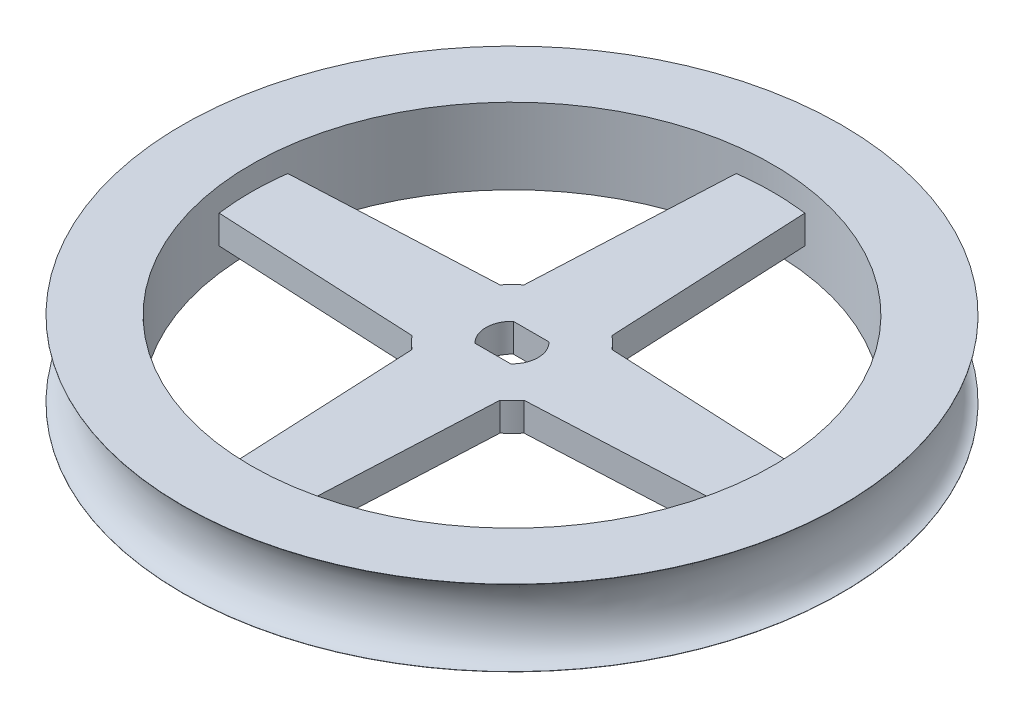
ISO-10303-21;
HEADER;
FILE_DESCRIPTION(('STEP AP214'),'2;1');
FILE_NAME('part.step','',(''),(''),'','','');
FILE_SCHEMA(('AUTOMOTIVE_DESIGN { 1 0 10303 214 1 1 1 1 }'));
ENDSEC;
DATA;
#1=APPLICATION_CONTEXT('core data for automotive mechanical design processes');
#2=APPLICATION_PROTOCOL_DEFINITION('international standard','automotive_design',2000,#1);
#3=PRODUCT_CONTEXT('',#1,'mechanical');
#4=PRODUCT('Part','Part','',(#3));
#5=PRODUCT_RELATED_PRODUCT_CATEGORY('part','',(#4));
#6=PRODUCT_DEFINITION_FORMATION('','',#4);
#7=PRODUCT_DEFINITION_CONTEXT('part definition',#1,'design');
#8=PRODUCT_DEFINITION('design','',#6,#7);
#9=PRODUCT_DEFINITION_SHAPE('','',#8);
#10=(LENGTH_UNIT() NAMED_UNIT(*) SI_UNIT(.MILLI.,.METRE.));
#11=(NAMED_UNIT(*) PLANE_ANGLE_UNIT() SI_UNIT($,.RADIAN.));
#12=(NAMED_UNIT(*) SI_UNIT($,.STERADIAN.) SOLID_ANGLE_UNIT());
#13=UNCERTAINTY_MEASURE_WITH_UNIT(LENGTH_MEASURE(1.E-05),#10,'distance_accuracy_value','');
#14=(GEOMETRIC_REPRESENTATION_CONTEXT(3) GLOBAL_UNCERTAINTY_ASSIGNED_CONTEXT((#13)) GLOBAL_UNIT_ASSIGNED_CONTEXT((#10,
#11,#12)) REPRESENTATION_CONTEXT('',''));
#15=CARTESIAN_POINT('',(0.,0.,0.));
#16=DIRECTION('',(0.,0.,1.));
#17=DIRECTION('',(1.,0.,0.));
#18=AXIS2_PLACEMENT_3D('',#15,#16,#17);
#19=CARTESIAN_POINT('',(0.,1.5,0.));
#20=DIRECTION('',(0.,1.,0.));
#21=DIRECTION('',(0.,0.,1.));
#22=AXIS2_PLACEMENT_3D('',#19,#20,#21);
#23=PLANE('',#22);
#24=CARTESIAN_POINT('',(0.,1.5,0.));
#25=DIRECTION('',(0.,1.,0.));
#26=DIRECTION('',(0.,0.,1.));
#27=AXIS2_PLACEMENT_3D('',#24,#25,#26);
#28=CIRCLE('',#27,7.5);
#29=CARTESIAN_POINT('',(-4.63139295566276,1.5,-5.89916937290644));
#30=VERTEX_POINT('',#29);
#31=CARTESIAN_POINT('',(-5.89916937290616,1.5,-4.63139295566311));
#32=VERTEX_POINT('',#31);
#33=EDGE_CURVE('E214',#30,#32,#28,.T.);
#34=ORIENTED_EDGE('',*,*,#33,.T.);
#35=DIRECTION('',(-0.998869891868631,0.,0.0475282980796581));
#36=VECTOR('',#35,1.);
#37=CARTESIAN_POINT('',(-27.2613690615233,1.5,-3.61493525411162));
#38=LINE('',#37,#36);
#39=CARTESIAN_POINT('',(-27.2613690615233,1.5,-3.61493525411161));
#40=VERTEX_POINT('',#39);
#41=EDGE_CURVE('E217',#32,#40,#38,.T.);
#42=ORIENTED_EDGE('',*,*,#41,.T.);
#43=CARTESIAN_POINT('',(0.,1.5,0.));
#44=DIRECTION('',(0.,1.,0.));
#45=DIRECTION('',(0.,0.,1.));
#46=AXIS2_PLACEMENT_3D('',#43,#44,#45);
#47=CIRCLE('',#46,27.5);
#48=CARTESIAN_POINT('',(-27.2613690615236,1.5,3.61493525410967));
#49=VERTEX_POINT('',#48);
#50=EDGE_CURVE('E220',#40,#49,#47,.T.);
#51=ORIENTED_EDGE('',*,*,#50,.T.);
#52=DIRECTION('',(0.998869891868627,0.,0.0475282980797429));
#53=VECTOR('',#52,1.);
#54=CARTESIAN_POINT('',(-27.2613690615236,1.5,3.61493525410967));
#55=LINE('',#54,#53);
#56=CARTESIAN_POINT('',(-5.89916937290626,1.5,4.63139295566299));
#57=VERTEX_POINT('',#56);
#58=EDGE_CURVE('E222',#49,#57,#55,.T.);
#59=ORIENTED_EDGE('',*,*,#58,.T.);
#60=CARTESIAN_POINT('',(0.,1.5,0.));
#61=DIRECTION('',(0.,1.,0.));
#62=DIRECTION('',(0.,0.,1.));
#63=AXIS2_PLACEMENT_3D('',#60,#61,#62);
#64=CIRCLE('',#63,7.5);
#65=CARTESIAN_POINT('',(-4.63139295566309,1.5,5.89916937290618));
#66=VERTEX_POINT('',#65);
#67=EDGE_CURVE('E224',#57,#66,#64,.T.);
#68=ORIENTED_EDGE('',*,*,#67,.T.);
#69=DIRECTION('',(0.0475282980796571,0.,0.998869891868631));
#70=VECTOR('',#69,1.);
#71=CARTESIAN_POINT('',(-3.61493525411162,1.5,27.2613690615233));
#72=LINE('',#71,#70);
#73=CARTESIAN_POINT('',(-3.61493525411164,1.5,27.2613690615233));
#74=VERTEX_POINT('',#73);
#75=EDGE_CURVE('E226',#66,#74,#72,.T.);
#76=ORIENTED_EDGE('',*,*,#75,.T.);
#77=CARTESIAN_POINT('',(0.,1.5,0.));
#78=DIRECTION('',(0.,1.,0.));
#79=DIRECTION('',(0.,0.,1.));
#80=AXIS2_PLACEMENT_3D('',#77,#78,#79);
#81=CIRCLE('',#80,27.5);
#82=CARTESIAN_POINT('',(3.61493525410967,1.5,27.2613690615236));
#83=VERTEX_POINT('',#82);
#84=EDGE_CURVE('E228',#74,#83,#81,.T.);
#85=ORIENTED_EDGE('',*,*,#84,.T.);
#86=DIRECTION('',(0.0475282980797438,0.,-0.998869891868627));
#87=VECTOR('',#86,1.);
#88=CARTESIAN_POINT('',(3.61493525410967,1.5,27.2613690615236));
#89=LINE('',#88,#87);
#90=CARTESIAN_POINT('',(4.63139295566301,1.5,5.89916937290625));
#91=VERTEX_POINT('',#90);
#92=EDGE_CURVE('E230',#83,#91,#89,.T.);
#93=ORIENTED_EDGE('',*,*,#92,.T.);
#94=CARTESIAN_POINT('',(0.,1.5,0.));
#95=DIRECTION('',(0.,1.,0.));
#96=DIRECTION('',(0.,0.,1.));
#97=AXIS2_PLACEMENT_3D('',#94,#95,#96);
#98=CIRCLE('',#97,7.5);
#99=CARTESIAN_POINT('',(5.89916937290619,1.5,4.63139295566307));
#100=VERTEX_POINT('',#99);
#101=EDGE_CURVE('E232',#91,#100,#98,.T.);
#102=ORIENTED_EDGE('',*,*,#101,.T.);
#103=DIRECTION('',(0.998869891868632,0.,-0.0475282980796561));
#104=VECTOR('',#103,1.);
#105=CARTESIAN_POINT('',(27.2613690615233,1.5,3.61493525411162));
#106=LINE('',#105,#104);
#107=CARTESIAN_POINT('',(27.2613690615233,1.5,3.61493525411162));
#108=VERTEX_POINT('',#107);
#109=EDGE_CURVE('E234',#100,#108,#106,.T.);
#110=ORIENTED_EDGE('',*,*,#109,.T.);
#111=CARTESIAN_POINT('',(0.,1.5,0.));
#112=DIRECTION('',(0.,1.,0.));
#113=DIRECTION('',(0.,0.,1.));
#114=AXIS2_PLACEMENT_3D('',#111,#112,#113);
#115=CIRCLE('',#114,27.5);
#116=CARTESIAN_POINT('',(27.2613690615236,1.5,-3.61493525410967));
#117=VERTEX_POINT('',#116);
#118=EDGE_CURVE('E236',#108,#117,#115,.T.);
#119=ORIENTED_EDGE('',*,*,#118,.T.);
#120=DIRECTION('',(-0.998869891868628,0.,-0.0475282980797327));
#121=VECTOR('',#120,1.);
#122=CARTESIAN_POINT('',(27.2613690615236,1.5,-3.61493525410967));
#123=LINE('',#122,#121);
#124=CARTESIAN_POINT('',(5.89916937290644,1.5,-4.63139295566276));
#125=VERTEX_POINT('',#124);
#126=EDGE_CURVE('E238',#117,#125,#123,.T.);
#127=ORIENTED_EDGE('',*,*,#126,.T.);
#128=CARTESIAN_POINT('',(0.,1.5,0.));
#129=DIRECTION('',(0.,1.,0.));
#130=DIRECTION('',(0.,0.,1.));
#131=AXIS2_PLACEMENT_3D('',#128,#129,#130);
#132=CIRCLE('',#131,7.5);
#133=CARTESIAN_POINT('',(4.63139295566305,1.5,-5.89916937290621));
#134=VERTEX_POINT('',#133);
#135=EDGE_CURVE('E240',#125,#134,#132,.T.);
#136=ORIENTED_EDGE('',*,*,#135,.T.);
#137=DIRECTION('',(-0.0475282980796551,0.,-0.998869891868632));
#138=VECTOR('',#137,1.);
#139=CARTESIAN_POINT('',(3.61493525411163,1.5,-27.2613690615233));
#140=LINE('',#139,#138);
#141=CARTESIAN_POINT('',(3.61493525411162,1.5,-27.2613690615233));
#142=VERTEX_POINT('',#141);
#143=EDGE_CURVE('E242',#134,#142,#140,.T.);
#144=ORIENTED_EDGE('',*,*,#143,.T.);
#145=CARTESIAN_POINT('',(0.,1.5,0.));
#146=DIRECTION('',(0.,1.,0.));
#147=DIRECTION('',(0.,0.,1.));
#148=AXIS2_PLACEMENT_3D('',#145,#146,#147);
#149=CIRCLE('',#148,27.5);
#150=CARTESIAN_POINT('',(-3.61493525410967,1.5,-27.2613690615236));
#151=VERTEX_POINT('',#150);
#152=EDGE_CURVE('E244',#142,#151,#149,.T.);
#153=ORIENTED_EDGE('',*,*,#152,.T.);
#154=DIRECTION('',(-0.0475282980797328,0.,0.998869891868628));
#155=VECTOR('',#154,1.);
#156=CARTESIAN_POINT('',(-3.61493525410967,1.5,-27.2613690615236));
#157=LINE('',#156,#155);
#158=EDGE_CURVE('E246',#151,#30,#157,.T.);
#159=ORIENTED_EDGE('',*,*,#158,.T.);
#160=EDGE_LOOP('',(#34,#42,#51,#59,#68,#76,#85,#93,#102,#110,#119,#127,#136,#144,#153,#159));
#161=FACE_BOUND('',#160,.T.);
#162=DIRECTION('',(1.,0.,0.));
#163=VECTOR('',#162,1.);
#164=CARTESIAN_POINT('',(-1.875,1.5,2.01168461742889));
#165=LINE('',#164,#163);
#166=CARTESIAN_POINT('',(-1.875,1.5,2.01168461742889));
#167=VERTEX_POINT('',#166);
#168=CARTESIAN_POINT('',(1.875,1.5,2.01168461742888));
#169=VERTEX_POINT('',#168);
#170=EDGE_CURVE('E186',#167,#169,#165,.T.);
#171=ORIENTED_EDGE('',*,*,#170,.F.);
#172=CARTESIAN_POINT('',(0.,1.5,0.));
#173=DIRECTION('',(0.,1.,0.));
#174=DIRECTION('',(0.,0.,1.));
#175=AXIS2_PLACEMENT_3D('',#172,#173,#174);
#176=CIRCLE('',#175,2.75);
#177=CARTESIAN_POINT('',(-1.875,1.5,-2.01168461742889));
#178=VERTEX_POINT('',#177);
#179=EDGE_CURVE('E178',#178,#167,#176,.T.);
#180=ORIENTED_EDGE('',*,*,#179,.F.);
#181=DIRECTION('',(-1.,0.,0.));
#182=VECTOR('',#181,1.);
#183=CARTESIAN_POINT('',(-1.875,1.5,-2.01168461742889));
#184=LINE('',#183,#182);
#185=CARTESIAN_POINT('',(1.875,1.5,-2.01168461742889));
#186=VERTEX_POINT('',#185);
#187=EDGE_CURVE('E200',#186,#178,#184,.T.);
#188=ORIENTED_EDGE('',*,*,#187,.F.);
#189=CARTESIAN_POINT('',(0.,1.5,0.));
#190=DIRECTION('',(0.,1.,0.));
#191=DIRECTION('',(0.,0.,1.));
#192=AXIS2_PLACEMENT_3D('',#189,#190,#191);
#193=CIRCLE('',#192,2.75);
#194=EDGE_CURVE('E198',#169,#186,#193,.T.);
#195=ORIENTED_EDGE('',*,*,#194,.F.);
#196=EDGE_LOOP('',(#171,#180,#188,#195));
#197=FACE_BOUND('',#196,.T.);
#198=ADVANCED_FACE('F41',(#161,#197),#23,.T.);
#199=CARTESIAN_POINT('',(0.,-1.5,0.));
#200=DIRECTION('',(0.,1.,0.));
#201=DIRECTION('',(0.,0.,1.));
#202=AXIS2_PLACEMENT_3D('',#199,#200,#201);
#203=PLANE('',#202);
#204=CARTESIAN_POINT('',(0.,-1.5,0.));
#205=DIRECTION('',(0.,1.,0.));
#206=DIRECTION('',(0.,0.,1.));
#207=AXIS2_PLACEMENT_3D('',#204,#205,#206);
#208=CIRCLE('',#207,7.5);
#209=CARTESIAN_POINT('',(-4.63139295566276,-1.5,-5.89916937290644));
#210=VERTEX_POINT('',#209);
#211=CARTESIAN_POINT('',(-5.89916937290616,-1.5,-4.63139295566311));
#212=VERTEX_POINT('',#211);
#213=EDGE_CURVE('E194',#210,#212,#208,.T.);
#214=ORIENTED_EDGE('',*,*,#213,.F.);
#215=DIRECTION('',(-0.0475282980797328,0.,0.998869891868628));
#216=VECTOR('',#215,1.);
#217=CARTESIAN_POINT('',(-3.61493525410967,-1.5,-27.2613690615236));
#218=LINE('',#217,#216);
#219=CARTESIAN_POINT('',(-3.61493525410967,-1.5,-27.2613690615236));
#220=VERTEX_POINT('',#219);
#221=EDGE_CURVE('E218',#220,#210,#218,.T.);
#222=ORIENTED_EDGE('',*,*,#221,.F.);
#223=CARTESIAN_POINT('',(0.,-1.5,0.));
#224=DIRECTION('',(0.,1.,0.));
#225=DIRECTION('',(0.,0.,1.));
#226=AXIS2_PLACEMENT_3D('',#223,#224,#225);
#227=CIRCLE('',#226,27.5);
#228=CARTESIAN_POINT('',(3.61493525411162,-1.5,-27.2613690615233));
#229=VERTEX_POINT('',#228);
#230=EDGE_CURVE('E277',#229,#220,#227,.T.);
#231=ORIENTED_EDGE('',*,*,#230,.F.);
#232=DIRECTION('',(-0.0475282980796551,0.,-0.998869891868632));
#233=VECTOR('',#232,1.);
#234=CARTESIAN_POINT('',(3.61493525411163,-1.5,-27.2613690615233));
#235=LINE('',#234,#233);
#236=CARTESIAN_POINT('',(4.63139295566305,-1.5,-5.89916937290621));
#237=VERTEX_POINT('',#236);
#238=EDGE_CURVE('E275',#237,#229,#235,.T.);
#239=ORIENTED_EDGE('',*,*,#238,.F.);
#240=CARTESIAN_POINT('',(0.,-1.5,0.));
#241=DIRECTION('',(0.,1.,0.));
#242=DIRECTION('',(0.,0.,1.));
#243=AXIS2_PLACEMENT_3D('',#240,#241,#242);
#244=CIRCLE('',#243,7.5);
#245=CARTESIAN_POINT('',(5.89916937290644,-1.5,-4.63139295566276));
#246=VERTEX_POINT('',#245);
#247=EDGE_CURVE('E273',#246,#237,#244,.T.);
#248=ORIENTED_EDGE('',*,*,#247,.F.);
#249=DIRECTION('',(-0.998869891868628,0.,-0.0475282980797327));
#250=VECTOR('',#249,1.);
#251=CARTESIAN_POINT('',(27.2613690615236,-1.5,-3.61493525410967));
#252=LINE('',#251,#250);
#253=CARTESIAN_POINT('',(27.2613690615236,-1.5,-3.61493525410967));
#254=VERTEX_POINT('',#253);
#255=EDGE_CURVE('E271',#254,#246,#252,.T.);
#256=ORIENTED_EDGE('',*,*,#255,.F.);
#257=CARTESIAN_POINT('',(0.,-1.5,0.));
#258=DIRECTION('',(0.,1.,0.));
#259=DIRECTION('',(0.,0.,1.));
#260=AXIS2_PLACEMENT_3D('',#257,#258,#259);
#261=CIRCLE('',#260,27.5);
#262=CARTESIAN_POINT('',(27.2613690615233,-1.5,3.61493525411162));
#263=VERTEX_POINT('',#262);
#264=EDGE_CURVE('E269',#263,#254,#261,.T.);
#265=ORIENTED_EDGE('',*,*,#264,.F.);
#266=DIRECTION('',(0.998869891868632,0.,-0.0475282980796561));
#267=VECTOR('',#266,1.);
#268=CARTESIAN_POINT('',(27.2613690615233,-1.5,3.61493525411162));
#269=LINE('',#268,#267);
#270=CARTESIAN_POINT('',(5.89916937290619,-1.5,4.63139295566307));
#271=VERTEX_POINT('',#270);
#272=EDGE_CURVE('E267',#271,#263,#269,.T.);
#273=ORIENTED_EDGE('',*,*,#272,.F.);
#274=CARTESIAN_POINT('',(0.,-1.5,0.));
#275=DIRECTION('',(0.,1.,0.));
#276=DIRECTION('',(0.,0.,1.));
#277=AXIS2_PLACEMENT_3D('',#274,#275,#276);
#278=CIRCLE('',#277,7.5);
#279=CARTESIAN_POINT('',(4.63139295566301,-1.5,5.89916937290625));
#280=VERTEX_POINT('',#279);
#281=EDGE_CURVE('E265',#280,#271,#278,.T.);
#282=ORIENTED_EDGE('',*,*,#281,.F.);
#283=DIRECTION('',(0.0475282980797438,0.,-0.998869891868627));
#284=VECTOR('',#283,1.);
#285=CARTESIAN_POINT('',(3.61493525410967,-1.5,27.2613690615236));
#286=LINE('',#285,#284);
#287=CARTESIAN_POINT('',(3.61493525410967,-1.5,27.2613690615236));
#288=VERTEX_POINT('',#287);
#289=EDGE_CURVE('E263',#288,#280,#286,.T.);
#290=ORIENTED_EDGE('',*,*,#289,.F.);
#291=CARTESIAN_POINT('',(0.,-1.5,0.));
#292=DIRECTION('',(0.,1.,0.));
#293=DIRECTION('',(0.,0.,1.));
#294=AXIS2_PLACEMENT_3D('',#291,#292,#293);
#295=CIRCLE('',#294,27.5);
#296=CARTESIAN_POINT('',(-3.61493525411164,-1.5,27.2613690615233));
#297=VERTEX_POINT('',#296);
#298=EDGE_CURVE('E261',#297,#288,#295,.T.);
#299=ORIENTED_EDGE('',*,*,#298,.F.);
#300=DIRECTION('',(0.0475282980796571,0.,0.998869891868631));
#301=VECTOR('',#300,1.);
#302=CARTESIAN_POINT('',(-3.61493525411162,-1.5,27.2613690615233));
#303=LINE('',#302,#301);
#304=CARTESIAN_POINT('',(-4.63139295566309,-1.5,5.89916937290618));
#305=VERTEX_POINT('',#304);
#306=EDGE_CURVE('E259',#305,#297,#303,.T.);
#307=ORIENTED_EDGE('',*,*,#306,.F.);
#308=CARTESIAN_POINT('',(0.,-1.5,0.));
#309=DIRECTION('',(0.,1.,0.));
#310=DIRECTION('',(0.,0.,1.));
#311=AXIS2_PLACEMENT_3D('',#308,#309,#310);
#312=CIRCLE('',#311,7.5);
#313=CARTESIAN_POINT('',(-5.89916937290626,-1.5,4.63139295566299));
#314=VERTEX_POINT('',#313);
#315=EDGE_CURVE('E257',#314,#305,#312,.T.);
#316=ORIENTED_EDGE('',*,*,#315,.F.);
#317=DIRECTION('',(0.998869891868627,0.,0.0475282980797429));
#318=VECTOR('',#317,1.);
#319=CARTESIAN_POINT('',(-27.2613690615236,-1.5,3.61493525410967));
#320=LINE('',#319,#318);
#321=CARTESIAN_POINT('',(-27.2613690615236,-1.5,3.61493525410967));
#322=VERTEX_POINT('',#321);
#323=EDGE_CURVE('E255',#322,#314,#320,.T.);
#324=ORIENTED_EDGE('',*,*,#323,.F.);
#325=CARTESIAN_POINT('',(0.,-1.5,0.));
#326=DIRECTION('',(0.,1.,0.));
#327=DIRECTION('',(0.,0.,1.));
#328=AXIS2_PLACEMENT_3D('',#325,#326,#327);
#329=CIRCLE('',#328,27.5);
#330=CARTESIAN_POINT('',(-27.2613690615233,-1.5,-3.61493525411161));
#331=VERTEX_POINT('',#330);
#332=EDGE_CURVE('E253',#331,#322,#329,.T.);
#333=ORIENTED_EDGE('',*,*,#332,.F.);
#334=DIRECTION('',(-0.998869891868631,0.,0.0475282980796581));
#335=VECTOR('',#334,1.);
#336=CARTESIAN_POINT('',(-27.2613690615233,-1.5,-3.61493525411162));
#337=LINE('',#336,#335);
#338=EDGE_CURVE('E251',#212,#331,#337,.T.);
#339=ORIENTED_EDGE('',*,*,#338,.F.);
#340=EDGE_LOOP('',(#214,#222,#231,#239,#248,#256,#265,#273,#282,#290,#299,#307,#316,#324,#333,#339));
#341=FACE_BOUND('',#340,.T.);
#342=CARTESIAN_POINT('',(0.,-1.5,0.));
#343=DIRECTION('',(0.,1.,0.));
#344=DIRECTION('',(0.,0.,1.));
#345=AXIS2_PLACEMENT_3D('',#342,#343,#344);
#346=CIRCLE('',#345,2.75);
#347=CARTESIAN_POINT('',(-1.875,-1.5,-2.01168461742889));
#348=VERTEX_POINT('',#347);
#349=CARTESIAN_POINT('',(-1.875,-1.5,2.01168461742889));
#350=VERTEX_POINT('',#349);
#351=EDGE_CURVE('E64',#348,#350,#346,.T.);
#352=ORIENTED_EDGE('',*,*,#351,.T.);
#353=DIRECTION('',(1.,0.,0.));
#354=VECTOR('',#353,1.);
#355=CARTESIAN_POINT('',(-1.875,-1.5,2.01168461742889));
#356=LINE('',#355,#354);
#357=CARTESIAN_POINT('',(1.875,-1.5,2.01168461742888));
#358=VERTEX_POINT('',#357);
#359=EDGE_CURVE('E193',#350,#358,#356,.T.);
#360=ORIENTED_EDGE('',*,*,#359,.T.);
#361=CARTESIAN_POINT('',(0.,-1.5,0.));
#362=DIRECTION('',(0.,1.,0.));
#363=DIRECTION('',(0.,0.,1.));
#364=AXIS2_PLACEMENT_3D('',#361,#362,#363);
#365=CIRCLE('',#364,2.75);
#366=CARTESIAN_POINT('',(1.875,-1.5,-2.01168461742889));
#367=VERTEX_POINT('',#366);
#368=EDGE_CURVE('E206',#358,#367,#365,.T.);
#369=ORIENTED_EDGE('',*,*,#368,.T.);
#370=DIRECTION('',(-1.,0.,0.));
#371=VECTOR('',#370,1.);
#372=CARTESIAN_POINT('',(-1.875,-1.5,-2.01168461742889));
#373=LINE('',#372,#371);
#374=EDGE_CURVE('E187',#367,#348,#373,.T.);
#375=ORIENTED_EDGE('',*,*,#374,.T.);
#376=EDGE_LOOP('',(#352,#360,#369,#375));
#377=FACE_BOUND('',#376,.T.);
#378=ADVANCED_FACE('F331',(#341,#377),#203,.F.);
#379=CARTESIAN_POINT('',(0.,1.5,0.));
#380=DIRECTION('',(0.,-1.,0.));
#381=DIRECTION('',(0.,0.,-1.));
#382=AXIS2_PLACEMENT_3D('',#379,#380,#381);
#383=CYLINDRICAL_SURFACE('',#382,7.5);
#384=ORIENTED_EDGE('',*,*,#213,.T.);
#385=DIRECTION('',(0.,-1.,0.));
#386=VECTOR('',#385,1.);
#387=CARTESIAN_POINT('',(-5.89916937290616,1.5,-4.63139295566311));
#388=LINE('',#387,#386);
#389=EDGE_CURVE('E12',#32,#212,#388,.T.);
#390=ORIENTED_EDGE('',*,*,#389,.F.);
#391=ORIENTED_EDGE('',*,*,#33,.F.);
#392=DIRECTION('',(0.,-1.,0.));
#393=VECTOR('',#392,1.);
#394=CARTESIAN_POINT('',(-4.63139295566276,1.5,-5.89916937290644));
#395=LINE('',#394,#393);
#396=EDGE_CURVE('E248',#30,#210,#395,.T.);
#397=ORIENTED_EDGE('',*,*,#396,.T.);
#398=EDGE_LOOP('',(#384,#390,#391,#397));
#399=FACE_BOUND('',#398,.T.);
#400=ADVANCED_FACE('F43',(#399),#383,.T.);
#401=CARTESIAN_POINT('',(-27.2613690615233,1.5,-3.61493525411162));
#402=DIRECTION('',(0.0475282980796581,0.,0.998869891868631));
#403=DIRECTION('',(0.998869891868631,0.,-0.0475282980796581));
#404=AXIS2_PLACEMENT_3D('',#401,#402,#403);
#405=PLANE('',#404);
#406=ORIENTED_EDGE('',*,*,#338,.T.);
#407=DIRECTION('',(0.,-1.,0.));
#408=VECTOR('',#407,1.);
#409=CARTESIAN_POINT('',(-27.2613690615233,1.5,-3.61493525411161));
#410=LINE('',#409,#408);
#411=EDGE_CURVE('E49',#40,#331,#410,.T.);
#412=ORIENTED_EDGE('',*,*,#411,.F.);
#413=ORIENTED_EDGE('',*,*,#41,.F.);
#414=ORIENTED_EDGE('',*,*,#389,.T.);
#415=EDGE_LOOP('',(#406,#412,#413,#414));
#416=FACE_BOUND('',#415,.T.);
#417=ADVANCED_FACE('F348',(#416),#405,.F.);
#418=CARTESIAN_POINT('',(0.,1.5,0.));
#419=DIRECTION('',(0.,-1.,0.));
#420=DIRECTION('',(0.,0.,-1.));
#421=AXIS2_PLACEMENT_3D('',#418,#419,#420);
#422=CYLINDRICAL_SURFACE('',#421,27.5);
#423=ORIENTED_EDGE('',*,*,#332,.T.);
#424=DIRECTION('',(0.,-1.,0.));
#425=VECTOR('',#424,1.);
#426=CARTESIAN_POINT('',(-27.2613690615236,1.5,3.61493525410967));
#427=LINE('',#426,#425);
#428=EDGE_CURVE('E318',#49,#322,#427,.T.);
#429=ORIENTED_EDGE('',*,*,#428,.F.);
#430=ORIENTED_EDGE('',*,*,#50,.F.);
#431=ORIENTED_EDGE('',*,*,#411,.T.);
#432=EDGE_LOOP('',(#423,#429,#430,#431));
#433=FACE_BOUND('',#432,.T.);
#434=ADVANCED_FACE('F325',(#433),#422,.T.);
#435=CARTESIAN_POINT('',(-27.2613690615236,1.5,3.61493525410967));
#436=DIRECTION('',(0.0475282980797429,0.,-0.998869891868627));
#437=DIRECTION('',(-0.998869891868627,0.,-0.0475282980797429));
#438=AXIS2_PLACEMENT_3D('',#435,#436,#437);
#439=PLANE('',#438);
#440=ORIENTED_EDGE('',*,*,#323,.T.);
#441=DIRECTION('',(0.,-1.,0.));
#442=VECTOR('',#441,1.);
#443=CARTESIAN_POINT('',(-5.89916937290626,1.5,4.63139295566299));
#444=LINE('',#443,#442);
#445=EDGE_CURVE('E315',#57,#314,#444,.T.);
#446=ORIENTED_EDGE('',*,*,#445,.F.);
#447=ORIENTED_EDGE('',*,*,#58,.F.);
#448=ORIENTED_EDGE('',*,*,#428,.T.);
#449=EDGE_LOOP('',(#440,#446,#447,#448));
#450=FACE_BOUND('',#449,.T.);
#451=ADVANCED_FACE('F337',(#450),#439,.F.);
#452=CARTESIAN_POINT('',(0.,1.5,0.));
#453=DIRECTION('',(0.,-1.,0.));
#454=DIRECTION('',(0.,0.,-1.));
#455=AXIS2_PLACEMENT_3D('',#452,#453,#454);
#456=CYLINDRICAL_SURFACE('',#455,7.5);
#457=ORIENTED_EDGE('',*,*,#315,.T.);
#458=DIRECTION('',(0.,-1.,0.));
#459=VECTOR('',#458,1.);
#460=CARTESIAN_POINT('',(-4.63139295566309,1.5,5.89916937290618));
#461=LINE('',#460,#459);
#462=EDGE_CURVE('E312',#66,#305,#461,.T.);
#463=ORIENTED_EDGE('',*,*,#462,.F.);
#464=ORIENTED_EDGE('',*,*,#67,.F.);
#465=ORIENTED_EDGE('',*,*,#445,.T.);
#466=EDGE_LOOP('',(#457,#463,#464,#465));
#467=FACE_BOUND('',#466,.T.);
#468=ADVANCED_FACE('F341',(#467),#456,.T.);
#469=CARTESIAN_POINT('',(-3.61493525411162,1.5,27.2613690615233));
#470=DIRECTION('',(0.998869891868631,0.,-0.0475282980796571));
#471=DIRECTION('',(-0.0475282980796572,0.,-0.998869891868632));
#472=AXIS2_PLACEMENT_3D('',#469,#470,#471);
#473=PLANE('',#472);
#474=ORIENTED_EDGE('',*,*,#306,.T.);
#475=DIRECTION('',(0.,-1.,0.));
#476=VECTOR('',#475,1.);
#477=CARTESIAN_POINT('',(-3.61493525411164,1.5,27.2613690615233));
#478=LINE('',#477,#476);
#479=EDGE_CURVE('E309',#74,#297,#478,.T.);
#480=ORIENTED_EDGE('',*,*,#479,.F.);
#481=ORIENTED_EDGE('',*,*,#75,.F.);
#482=ORIENTED_EDGE('',*,*,#462,.T.);
#483=EDGE_LOOP('',(#474,#480,#481,#482));
#484=FACE_BOUND('',#483,.T.);
#485=ADVANCED_FACE('F401',(#484),#473,.F.);
#486=CARTESIAN_POINT('',(0.,1.5,0.));
#487=DIRECTION('',(0.,-1.,0.));
#488=DIRECTION('',(0.,0.,-1.));
#489=AXIS2_PLACEMENT_3D('',#486,#487,#488);
#490=CYLINDRICAL_SURFACE('',#489,27.5);
#491=ORIENTED_EDGE('',*,*,#298,.T.);
#492=DIRECTION('',(0.,-1.,0.));
#493=VECTOR('',#492,1.);
#494=CARTESIAN_POINT('',(3.61493525410967,1.5,27.2613690615236));
#495=LINE('',#494,#493);
#496=EDGE_CURVE('E306',#83,#288,#495,.T.);
#497=ORIENTED_EDGE('',*,*,#496,.F.);
#498=ORIENTED_EDGE('',*,*,#84,.F.);
#499=ORIENTED_EDGE('',*,*,#479,.T.);
#500=EDGE_LOOP('',(#491,#497,#498,#499));
#501=FACE_BOUND('',#500,.T.);
#502=ADVANCED_FACE('F398',(#501),#490,.T.);
#503=CARTESIAN_POINT('',(3.61493525410967,1.5,27.2613690615236));
#504=DIRECTION('',(-0.998869891868627,0.,-0.0475282980797438));
#505=DIRECTION('',(-0.0475282980797438,0.,0.998869891868627));
#506=AXIS2_PLACEMENT_3D('',#503,#504,#505);
#507=PLANE('',#506);
#508=ORIENTED_EDGE('',*,*,#289,.T.);
#509=DIRECTION('',(0.,-1.,0.));
#510=VECTOR('',#509,1.);
#511=CARTESIAN_POINT('',(4.63139295566301,1.5,5.89916937290625));
#512=LINE('',#511,#510);
#513=EDGE_CURVE('E303',#91,#280,#512,.T.);
#514=ORIENTED_EDGE('',*,*,#513,.F.);
#515=ORIENTED_EDGE('',*,*,#92,.F.);
#516=ORIENTED_EDGE('',*,*,#496,.T.);
#517=EDGE_LOOP('',(#508,#514,#515,#516));
#518=FACE_BOUND('',#517,.T.);
#519=ADVANCED_FACE('F394',(#518),#507,.F.);
#520=CARTESIAN_POINT('',(0.,1.5,0.));
#521=DIRECTION('',(0.,-1.,0.));
#522=DIRECTION('',(0.,0.,-1.));
#523=AXIS2_PLACEMENT_3D('',#520,#521,#522);
#524=CYLINDRICAL_SURFACE('',#523,7.5);
#525=ORIENTED_EDGE('',*,*,#281,.T.);
#526=DIRECTION('',(0.,-1.,0.));
#527=VECTOR('',#526,1.);
#528=CARTESIAN_POINT('',(5.89916937290619,1.5,4.63139295566307));
#529=LINE('',#528,#527);
#530=EDGE_CURVE('E300',#100,#271,#529,.T.);
#531=ORIENTED_EDGE('',*,*,#530,.F.);
#532=ORIENTED_EDGE('',*,*,#101,.F.);
#533=ORIENTED_EDGE('',*,*,#513,.T.);
#534=EDGE_LOOP('',(#525,#531,#532,#533));
#535=FACE_BOUND('',#534,.T.);
#536=ADVANCED_FACE('F390',(#535),#524,.T.);
#537=CARTESIAN_POINT('',(27.2613690615233,1.5,3.61493525411162));
#538=DIRECTION('',(-0.0475282980796561,0.,-0.998869891868631));
#539=DIRECTION('',(-0.998869891868632,0.,0.0475282980796561));
#540=AXIS2_PLACEMENT_3D('',#537,#538,#539);
#541=PLANE('',#540);
#542=ORIENTED_EDGE('',*,*,#272,.T.);
#543=DIRECTION('',(0.,-1.,0.));
#544=VECTOR('',#543,1.);
#545=CARTESIAN_POINT('',(27.2613690615233,1.5,3.61493525411162));
#546=LINE('',#545,#544);
#547=EDGE_CURVE('E297',#108,#263,#546,.T.);
#548=ORIENTED_EDGE('',*,*,#547,.F.);
#549=ORIENTED_EDGE('',*,*,#109,.F.);
#550=ORIENTED_EDGE('',*,*,#530,.T.);
#551=EDGE_LOOP('',(#542,#548,#549,#550));
#552=FACE_BOUND('',#551,.T.);
#553=ADVANCED_FACE('F385',(#552),#541,.F.);
#554=CARTESIAN_POINT('',(0.,1.5,0.));
#555=DIRECTION('',(0.,-1.,0.));
#556=DIRECTION('',(0.,0.,-1.));
#557=AXIS2_PLACEMENT_3D('',#554,#555,#556);
#558=CYLINDRICAL_SURFACE('',#557,27.5);
#559=ORIENTED_EDGE('',*,*,#264,.T.);
#560=DIRECTION('',(0.,-1.,0.));
#561=VECTOR('',#560,1.);
#562=CARTESIAN_POINT('',(27.2613690615236,1.5,-3.61493525410967));
#563=LINE('',#562,#561);
#564=EDGE_CURVE('E294',#117,#254,#563,.T.);
#565=ORIENTED_EDGE('',*,*,#564,.F.);
#566=ORIENTED_EDGE('',*,*,#118,.F.);
#567=ORIENTED_EDGE('',*,*,#547,.T.);
#568=EDGE_LOOP('',(#559,#565,#566,#567));
#569=FACE_BOUND('',#568,.T.);
#570=ADVANCED_FACE('F379',(#569),#558,.T.);
#571=CARTESIAN_POINT('',(27.2613690615236,1.5,-3.61493525410967));
#572=DIRECTION('',(-0.0475282980797327,0.,0.998869891868628));
#573=DIRECTION('',(0.998869891868628,0.,0.0475282980797328));
#574=AXIS2_PLACEMENT_3D('',#571,#572,#573);
#575=PLANE('',#574);
#576=ORIENTED_EDGE('',*,*,#255,.T.);
#577=DIRECTION('',(0.,-1.,0.));
#578=VECTOR('',#577,1.);
#579=CARTESIAN_POINT('',(5.89916937290644,1.5,-4.63139295566276));
#580=LINE('',#579,#578);
#581=EDGE_CURVE('E291',#125,#246,#580,.T.);
#582=ORIENTED_EDGE('',*,*,#581,.F.);
#583=ORIENTED_EDGE('',*,*,#126,.F.);
#584=ORIENTED_EDGE('',*,*,#564,.T.);
#585=EDGE_LOOP('',(#576,#582,#583,#584));
#586=FACE_BOUND('',#585,.T.);
#587=ADVANCED_FACE('F375',(#586),#575,.F.);
#588=CARTESIAN_POINT('',(0.,1.5,0.));
#589=DIRECTION('',(0.,-1.,0.));
#590=DIRECTION('',(0.,0.,-1.));
#591=AXIS2_PLACEMENT_3D('',#588,#589,#590);
#592=CYLINDRICAL_SURFACE('',#591,7.5);
#593=ORIENTED_EDGE('',*,*,#247,.T.);
#594=DIRECTION('',(0.,-1.,0.));
#595=VECTOR('',#594,1.);
#596=CARTESIAN_POINT('',(4.63139295566305,1.5,-5.89916937290621));
#597=LINE('',#596,#595);
#598=EDGE_CURVE('E288',#134,#237,#597,.T.);
#599=ORIENTED_EDGE('',*,*,#598,.F.);
#600=ORIENTED_EDGE('',*,*,#135,.F.);
#601=ORIENTED_EDGE('',*,*,#581,.T.);
#602=EDGE_LOOP('',(#593,#599,#600,#601));
#603=FACE_BOUND('',#602,.T.);
#604=ADVANCED_FACE('F370',(#603),#592,.T.);
#605=CARTESIAN_POINT('',(3.61493525411163,1.5,-27.2613690615233));
#606=DIRECTION('',(-0.998869891868631,0.,0.0475282980796551));
#607=DIRECTION('',(0.0475282980796551,0.,0.998869891868632));
#608=AXIS2_PLACEMENT_3D('',#605,#606,#607);
#609=PLANE('',#608);
#610=ORIENTED_EDGE('',*,*,#238,.T.);
#611=DIRECTION('',(0.,-1.,0.));
#612=VECTOR('',#611,1.);
#613=CARTESIAN_POINT('',(3.61493525411162,1.5,-27.2613690615233));
#614=LINE('',#613,#612);
#615=EDGE_CURVE('E285',#142,#229,#614,.T.);
#616=ORIENTED_EDGE('',*,*,#615,.F.);
#617=ORIENTED_EDGE('',*,*,#143,.F.);
#618=ORIENTED_EDGE('',*,*,#598,.T.);
#619=EDGE_LOOP('',(#610,#616,#617,#618));
#620=FACE_BOUND('',#619,.T.);
#621=ADVANCED_FACE('F364',(#620),#609,.F.);
#622=CARTESIAN_POINT('',(0.,1.5,0.));
#623=DIRECTION('',(0.,-1.,0.));
#624=DIRECTION('',(0.,0.,-1.));
#625=AXIS2_PLACEMENT_3D('',#622,#623,#624);
#626=CYLINDRICAL_SURFACE('',#625,27.5);
#627=ORIENTED_EDGE('',*,*,#230,.T.);
#628=DIRECTION('',(0.,-1.,0.));
#629=VECTOR('',#628,1.);
#630=CARTESIAN_POINT('',(-3.61493525410967,1.5,-27.2613690615236));
#631=LINE('',#630,#629);
#632=EDGE_CURVE('E282',#151,#220,#631,.T.);
#633=ORIENTED_EDGE('',*,*,#632,.F.);
#634=ORIENTED_EDGE('',*,*,#152,.F.);
#635=ORIENTED_EDGE('',*,*,#615,.T.);
#636=EDGE_LOOP('',(#627,#633,#634,#635));
#637=FACE_BOUND('',#636,.T.);
#638=ADVANCED_FACE('F360',(#637),#626,.T.);
#639=CARTESIAN_POINT('',(-3.61493525410967,1.5,-27.2613690615236));
#640=DIRECTION('',(0.998869891868628,0.,0.0475282980797328));
#641=DIRECTION('',(0.0475282980797328,0.,-0.998869891868628));
#642=AXIS2_PLACEMENT_3D('',#639,#640,#641);
#643=PLANE('',#642);
#644=ORIENTED_EDGE('',*,*,#221,.T.);
#645=ORIENTED_EDGE('',*,*,#396,.F.);
#646=ORIENTED_EDGE('',*,*,#158,.F.);
#647=ORIENTED_EDGE('',*,*,#632,.T.);
#648=EDGE_LOOP('',(#644,#645,#646,#647));
#649=FACE_BOUND('',#648,.T.);
#650=ADVANCED_FACE('F355',(#649),#643,.F.);
#651=CARTESIAN_POINT('',(0.,1.5,0.));
#652=DIRECTION('',(0.,-1.,0.));
#653=DIRECTION('',(0.,0.,-1.));
#654=AXIS2_PLACEMENT_3D('',#651,#652,#653);
#655=CYLINDRICAL_SURFACE('',#654,2.75);
#656=ORIENTED_EDGE('',*,*,#351,.F.);
#657=DIRECTION('',(0.,-1.,0.));
#658=VECTOR('',#657,1.);
#659=CARTESIAN_POINT('',(-1.875,1.5,-2.01168461742889));
#660=LINE('',#659,#658);
#661=EDGE_CURVE('E182',#178,#348,#660,.T.);
#662=ORIENTED_EDGE('',*,*,#661,.F.);
#663=ORIENTED_EDGE('',*,*,#179,.T.);
#664=DIRECTION('',(0.,-1.,0.));
#665=VECTOR('',#664,1.);
#666=CARTESIAN_POINT('',(-1.875,1.5,2.01168461742889));
#667=LINE('',#666,#665);
#668=EDGE_CURVE('E181',#167,#350,#667,.T.);
#669=ORIENTED_EDGE('',*,*,#668,.T.);
#670=EDGE_LOOP('',(#656,#662,#663,#669));
#671=FACE_BOUND('',#670,.T.);
#672=ADVANCED_FACE('F180',(#671),#655,.F.);
#673=CARTESIAN_POINT('',(-1.875,1.5,2.01168461742889));
#674=DIRECTION('',(0.,0.,-1.));
#675=DIRECTION('',(-1.,0.,0.));
#676=AXIS2_PLACEMENT_3D('',#673,#674,#675);
#677=PLANE('',#676);
#678=ORIENTED_EDGE('',*,*,#359,.F.);
#679=ORIENTED_EDGE('',*,*,#668,.F.);
#680=ORIENTED_EDGE('',*,*,#170,.T.);
#681=DIRECTION('',(0.,-1.,0.));
#682=VECTOR('',#681,1.);
#683=CARTESIAN_POINT('',(1.875,1.5,2.01168461742888));
#684=LINE('',#683,#682);
#685=EDGE_CURVE('E195',#169,#358,#684,.T.);
#686=ORIENTED_EDGE('',*,*,#685,.T.);
#687=EDGE_LOOP('',(#678,#679,#680,#686));
#688=FACE_BOUND('',#687,.T.);
#689=ADVANCED_FACE('F190',(#688),#677,.T.);
#690=CARTESIAN_POINT('',(0.,1.5,0.));
#691=DIRECTION('',(0.,-1.,0.));
#692=DIRECTION('',(0.,0.,-1.));
#693=AXIS2_PLACEMENT_3D('',#690,#691,#692);
#694=CYLINDRICAL_SURFACE('',#693,2.75);
#695=ORIENTED_EDGE('',*,*,#368,.F.);
#696=ORIENTED_EDGE('',*,*,#685,.F.);
#697=ORIENTED_EDGE('',*,*,#194,.T.);
#698=DIRECTION('',(0.,-1.,0.));
#699=VECTOR('',#698,1.);
#700=CARTESIAN_POINT('',(1.875,1.5,-2.01168461742889));
#701=LINE('',#700,#699);
#702=EDGE_CURVE('E56',#186,#367,#701,.T.);
#703=ORIENTED_EDGE('',*,*,#702,.T.);
#704=EDGE_LOOP('',(#695,#696,#697,#703));
#705=FACE_BOUND('',#704,.T.);
#706=ADVANCED_FACE('F483',(#705),#694,.F.);
#707=CARTESIAN_POINT('',(-1.875,1.5,-2.01168461742889));
#708=DIRECTION('',(0.,0.,1.));
#709=DIRECTION('',(1.,0.,0.));
#710=AXIS2_PLACEMENT_3D('',#707,#708,#709);
#711=PLANE('',#710);
#712=ORIENTED_EDGE('',*,*,#374,.F.);
#713=ORIENTED_EDGE('',*,*,#702,.F.);
#714=ORIENTED_EDGE('',*,*,#187,.T.);
#715=ORIENTED_EDGE('',*,*,#661,.T.);
#716=EDGE_LOOP('',(#712,#713,#714,#715));
#717=FACE_BOUND('',#716,.T.);
#718=ADVANCED_FACE('F489',(#717),#711,.T.);
#719=CLOSED_SHELL('',(#198,#378,#400,#417,#434,#451,#468,#485,#502,#519,#536,#553,#570,#587,
#604,#621,#638,#650,#672,#689,#706,#718));
#720=MANIFOLD_SOLID_BREP('B2',#719);
#721=CARTESIAN_POINT('',(0.,4.,0.));
#722=DIRECTION('',(0.,1.,0.));
#723=DIRECTION('',(0.,0.,1.));
#724=AXIS2_PLACEMENT_3D('',#721,#722,#723);
#725=PLANE('',#724);
#726=CARTESIAN_POINT('',(0.,4.,0.));
#727=DIRECTION('',(0.,1.,0.));
#728=DIRECTION('',(0.,0.,1.));
#729=AXIS2_PLACEMENT_3D('',#726,#727,#728);
#730=CIRCLE('',#729,27.5);
#731=CARTESIAN_POINT('',(0.,4.,27.5));
#732=VERTEX_POINT('',#731);
#733=EDGE_CURVE('E40',#732,#732,#730,.T.);
#734=ORIENTED_EDGE('',*,*,#733,.F.);
#735=EDGE_LOOP('',(#734));
#736=FACE_BOUND('',#735,.T.);
#737=CARTESIAN_POINT('',(0.,4.,0.));
#738=DIRECTION('',(0.,1.,0.));
#739=DIRECTION('',(0.,0.,1.));
#740=AXIS2_PLACEMENT_3D('',#737,#738,#739);
#741=CIRCLE('',#740,34.7396085764097);
#742=CARTESIAN_POINT('',(0.,4.,34.7396085764097));
#743=VERTEX_POINT('',#742);
#744=EDGE_CURVE('E596',#743,#743,#741,.F.);
#745=ORIENTED_EDGE('',*,*,#744,.F.);
#746=EDGE_LOOP('',(#745));
#747=FACE_BOUND('',#746,.T.);
#748=ADVANCED_FACE('F583',(#736,#747),#725,.T.);
#749=CARTESIAN_POINT('',(0.,-4.,0.));
#750=DIRECTION('',(0.,1.,0.));
#751=DIRECTION('',(0.,0.,1.));
#752=AXIS2_PLACEMENT_3D('',#749,#750,#751);
#753=PLANE('',#752);
#754=CARTESIAN_POINT('',(0.,-4.,0.));
#755=DIRECTION('',(0.,1.,0.));
#756=DIRECTION('',(0.,0.,1.));
#757=AXIS2_PLACEMENT_3D('',#754,#755,#756);
#758=CIRCLE('',#757,27.5);
#759=CARTESIAN_POINT('',(0.,-4.,27.5));
#760=VERTEX_POINT('',#759);
#761=EDGE_CURVE('E591',#760,#760,#758,.T.);
#762=ORIENTED_EDGE('',*,*,#761,.T.);
#763=EDGE_LOOP('',(#762));
#764=FACE_BOUND('',#763,.T.);
#765=CARTESIAN_POINT('',(0.,-4.,0.));
#766=DIRECTION('',(0.,1.,0.));
#767=DIRECTION('',(0.,0.,1.));
#768=AXIS2_PLACEMENT_3D('',#765,#766,#767);
#769=CIRCLE('',#768,34.7396085764097);
#770=CARTESIAN_POINT('',(0.,-4.,34.7396085764097));
#771=VERTEX_POINT('',#770);
#772=EDGE_CURVE('E606',#771,#771,#769,.F.);
#773=ORIENTED_EDGE('',*,*,#772,.T.);
#774=EDGE_LOOP('',(#773));
#775=FACE_BOUND('',#774,.T.);
#776=ADVANCED_FACE('F585',(#764,#775),#753,.F.);
#777=CARTESIAN_POINT('',(0.,4.,0.));
#778=DIRECTION('',(0.,-1.,0.));
#779=DIRECTION('',(0.,0.,-1.));
#780=AXIS2_PLACEMENT_3D('',#777,#778,#779);
#781=CYLINDRICAL_SURFACE('',#780,27.5);
#782=ORIENTED_EDGE('',*,*,#733,.T.);
#783=EDGE_LOOP('',(#782));
#784=FACE_BOUND('',#783,.T.);
#785=ORIENTED_EDGE('',*,*,#761,.F.);
#786=EDGE_LOOP('',(#785));
#787=FACE_BOUND('',#786,.T.);
#788=ADVANCED_FACE('F624',(#784,#787),#781,.F.);
#789=CARTESIAN_POINT('',(0.,8.79245959853953,0.));
#790=DIRECTION('',(0.,1.,0.));
#791=DIRECTION('',(0.,0.,1.));
#792=AXIS2_PLACEMENT_3D('',#789,#790,#791);
#793=CYLINDRICAL_SURFACE('',#792,34.7396085764097);
#794=ORIENTED_EDGE('',*,*,#744,.T.);
#795=EDGE_LOOP('',(#794));
#796=FACE_BOUND('',#795,.T.);
#797=CARTESIAN_POINT('',(0.,3.97759487444089,0.));
#798=DIRECTION('',(0.,1.,0.));
#799=DIRECTION('',(0.,0.,1.));
#800=AXIS2_PLACEMENT_3D('',#797,#798,#799);
#801=CIRCLE('',#800,34.7396085764097);
#802=CARTESIAN_POINT('',(0.,3.97759487444089,34.7396085764097));
#803=VERTEX_POINT('',#802);
#804=EDGE_CURVE('E601',#803,#803,#801,.F.);
#805=ORIENTED_EDGE('',*,*,#804,.F.);
#806=EDGE_LOOP('',(#805));
#807=FACE_BOUND('',#806,.T.);
#808=ADVANCED_FACE('F616',(#796,#807),#793,.T.);
#809=CARTESIAN_POINT('',(0.,-3.97759487444089,0.));
#810=DIRECTION('',(0.,1.,0.));
#811=DIRECTION('',(0.,0.,1.));
#812=AXIS2_PLACEMENT_3D('',#809,#810,#811);
#813=CIRCLE('',#812,34.7396085764097);
#814=CARTESIAN_POINT('',(0.,-3.97759487444089,34.7396085764097));
#815=VERTEX_POINT('',#814);
#816=EDGE_CURVE('E587',#815,#815,#813,.T.);
#817=ORIENTED_EDGE('',*,*,#816,.F.);
#818=EDGE_LOOP('',(#817));
#819=FACE_BOUND('',#818,.T.);
#820=ORIENTED_EDGE('',*,*,#772,.F.);
#821=EDGE_LOOP('',(#820));
#822=FACE_BOUND('',#821,.T.);
#823=ADVANCED_FACE('F632',(#819,#822),#793,.T.);
#824=CARTESIAN_POINT('',(0.,0.,35.));
#825=DIRECTION('',(1.,0.,0.));
#826=DIRECTION('',(0.,-1.,0.));
#827=AXIS2_PLACEMENT_3D('',#824,#825,#826);
#828=ELLIPSE('',#827,4.,2.46363852853754);
#829=CARTESIAN_POINT('',(0.,4.56852456392199,0.));
#830=DIRECTION('',(0.,1.,0.));
#831=AXIS1_PLACEMENT('',#829,#830);
#832=SURFACE_OF_REVOLUTION('',#828,#831);
#833=ORIENTED_EDGE('',*,*,#816,.T.);
#834=EDGE_LOOP('',(#833));
#835=FACE_BOUND('',#834,.T.);
#836=ORIENTED_EDGE('',*,*,#804,.T.);
#837=EDGE_LOOP('',(#836));
#838=FACE_BOUND('',#837,.T.);
#839=ADVANCED_FACE('F629',(#835,#838),#832,.T.);
#840=CLOSED_SHELL('',(#748,#776,#788,#808,#823,#839));
#841=MANIFOLD_SOLID_BREP('B6',#840);
#842=ADVANCED_BREP_SHAPE_REPRESENTATION('',(#18,#720,#841),#14);
#843=SHAPE_DEFINITION_REPRESENTATION(#9,#842);
ENDSEC;
END-ISO-10303-21;
